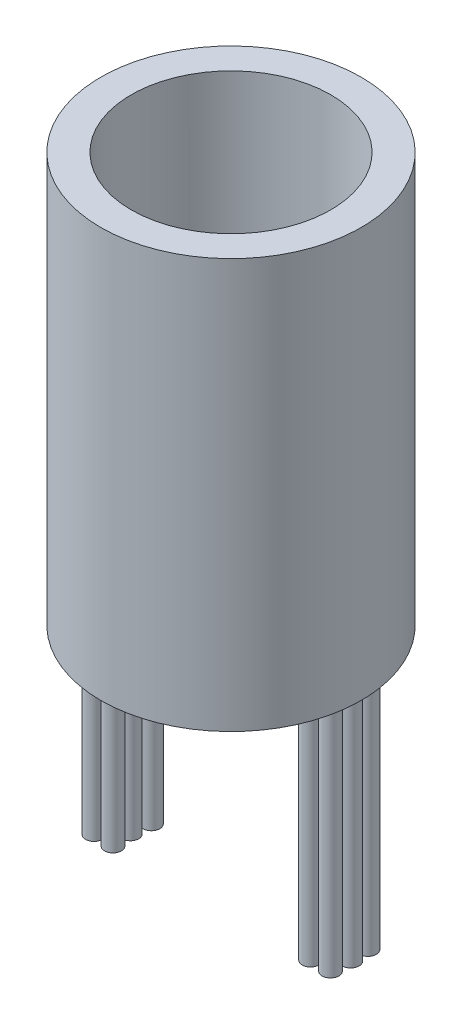
ISO-10303-21;
HEADER;
FILE_DESCRIPTION(('STEP AP214'),'2;1');
FILE_NAME('part.step','',(''),(''),'','','');
FILE_SCHEMA(('AUTOMOTIVE_DESIGN { 1 0 10303 214 1 1 1 1 }'));
ENDSEC;
DATA;
#1=APPLICATION_CONTEXT('core data for automotive mechanical design processes');
#2=APPLICATION_PROTOCOL_DEFINITION('international standard','automotive_design',2000,#1);
#3=PRODUCT_CONTEXT('',#1,'mechanical');
#4=PRODUCT('Part','Part','',(#3));
#5=PRODUCT_RELATED_PRODUCT_CATEGORY('part','',(#4));
#6=PRODUCT_DEFINITION_FORMATION('','',#4);
#7=PRODUCT_DEFINITION_CONTEXT('part definition',#1,'design');
#8=PRODUCT_DEFINITION('design','',#6,#7);
#9=PRODUCT_DEFINITION_SHAPE('','',#8);
#10=(LENGTH_UNIT() NAMED_UNIT(*) SI_UNIT(.MILLI.,.METRE.));
#11=(NAMED_UNIT(*) PLANE_ANGLE_UNIT() SI_UNIT($,.RADIAN.));
#12=(NAMED_UNIT(*) SI_UNIT($,.STERADIAN.) SOLID_ANGLE_UNIT());
#13=UNCERTAINTY_MEASURE_WITH_UNIT(LENGTH_MEASURE(1.E-05),#10,'distance_accuracy_value','');
#14=(GEOMETRIC_REPRESENTATION_CONTEXT(3) GLOBAL_UNCERTAINTY_ASSIGNED_CONTEXT((#13)) GLOBAL_UNIT_ASSIGNED_CONTEXT((#10,
#11,#12)) REPRESENTATION_CONTEXT('',''));
#15=CARTESIAN_POINT('',(0.,0.,0.));
#16=DIRECTION('',(0.,0.,1.));
#17=DIRECTION('',(1.,0.,0.));
#18=AXIS2_PLACEMENT_3D('',#15,#16,#17);
#19=CARTESIAN_POINT('',(0.,19.3,0.));
#20=DIRECTION('',(0.,1.,0.));
#21=DIRECTION('',(0.,0.,1.));
#22=AXIS2_PLACEMENT_3D('',#19,#20,#21);
#23=CYLINDRICAL_SURFACE('',#22,4.75);
#24=CARTESIAN_POINT('',(0.,19.5,0.));
#25=DIRECTION('',(0.,1.,0.));
#26=DIRECTION('',(0.,0.,1.));
#27=AXIS2_PLACEMENT_3D('',#24,#25,#26);
#28=CIRCLE('',#27,4.75);
#29=CARTESIAN_POINT('',(0.,19.5,4.75));
#30=VERTEX_POINT('',#29);
#31=EDGE_CURVE('E313',#30,#30,#28,.T.);
#32=ORIENTED_EDGE('',*,*,#31,.T.);
#33=EDGE_LOOP('',(#32));
#34=FACE_BOUND('',#33,.T.);
#35=CARTESIAN_POINT('',(0.,0.,0.));
#36=DIRECTION('',(0.,1.,0.));
#37=DIRECTION('',(0.,0.,1.));
#38=AXIS2_PLACEMENT_3D('',#35,#36,#37);
#39=CIRCLE('',#38,4.75);
#40=CARTESIAN_POINT('',(-4.57099580963266,0.,1.29170325861657));
#41=VERTEX_POINT('',#40);
#42=CARTESIAN_POINT('',(-4.72203407139843,0.,0.514678762484313));
#43=VERTEX_POINT('',#42);
#44=EDGE_CURVE('E94',#41,#43,#39,.F.);
#45=ORIENTED_EDGE('',*,*,#44,.T.);
#46=CARTESIAN_POINT('',(-4.73348234326202,0.,0.395783913299547));
#47=VERTEX_POINT('',#46);
#48=EDGE_CURVE('E108',#43,#47,#39,.F.);
#49=ORIENTED_EDGE('',*,*,#48,.T.);
#50=CARTESIAN_POINT('',(-4.73348234326202,0.,-0.395783913299547));
#51=VERTEX_POINT('',#50);
#52=EDGE_CURVE('E338',#47,#51,#39,.F.);
#53=ORIENTED_EDGE('',*,*,#52,.T.);
#54=CARTESIAN_POINT('',(-4.72203407139843,0.,-0.514678762484313));
#55=VERTEX_POINT('',#54);
#56=EDGE_CURVE('E333',#51,#55,#39,.F.);
#57=ORIENTED_EDGE('',*,*,#56,.T.);
#58=CARTESIAN_POINT('',(-4.57099580963266,0.,-1.29170325861657));
#59=VERTEX_POINT('',#58);
#60=EDGE_CURVE('E339',#55,#59,#39,.F.);
#61=ORIENTED_EDGE('',*,*,#60,.T.);
#62=CARTESIAN_POINT('',(4.57099580963266,0.,-1.29170325861657));
#63=VERTEX_POINT('',#62);
#64=EDGE_CURVE('E340',#59,#63,#39,.F.);
#65=ORIENTED_EDGE('',*,*,#64,.T.);
#66=CARTESIAN_POINT('',(4.72203407139843,0.,-0.514678762484311));
#67=VERTEX_POINT('',#66);
#68=EDGE_CURVE('E342',#63,#67,#39,.F.);
#69=ORIENTED_EDGE('',*,*,#68,.T.);
#70=CARTESIAN_POINT('',(4.73348234326202,0.,-0.395783913299544));
#71=VERTEX_POINT('',#70);
#72=EDGE_CURVE('E52',#67,#71,#39,.F.);
#73=ORIENTED_EDGE('',*,*,#72,.T.);
#74=CARTESIAN_POINT('',(4.73348234326202,0.,0.395783913299548));
#75=VERTEX_POINT('',#74);
#76=EDGE_CURVE('E267',#71,#75,#39,.F.);
#77=ORIENTED_EDGE('',*,*,#76,.T.);
#78=CARTESIAN_POINT('',(4.72203407139843,0.,0.514678762484313));
#79=VERTEX_POINT('',#78);
#80=EDGE_CURVE('E272',#75,#79,#39,.F.);
#81=ORIENTED_EDGE('',*,*,#80,.T.);
#82=CARTESIAN_POINT('',(4.57099580963266,0.,1.29170325861657));
#83=VERTEX_POINT('',#82);
#84=EDGE_CURVE('E97',#79,#83,#39,.F.);
#85=ORIENTED_EDGE('',*,*,#84,.T.);
#86=EDGE_CURVE('E91',#83,#41,#39,.F.);
#87=ORIENTED_EDGE('',*,*,#86,.T.);
#88=EDGE_LOOP('',(#45,#49,#53,#57,#61,#65,#69,#73,#77,#81,#85,#87));
#89=FACE_BOUND('',#88,.T.);
#90=ADVANCED_FACE('F37',(#34,#89),#23,.F.);
#91=CARTESIAN_POINT('',(0.,0.,0.));
#92=DIRECTION('',(0.,1.,0.));
#93=DIRECTION('',(0.,0.,1.));
#94=AXIS2_PLACEMENT_3D('',#91,#92,#93);
#95=PLANE('',#94);
#96=CARTESIAN_POINT('',(5.70012035558298,0.,0.));
#97=DIRECTION('',(0.,1.,0.));
#98=DIRECTION('',(0.,0.,1.));
#99=AXIS2_PLACEMENT_3D('',#96,#97,#98);
#100=CIRCLE('',#99,0.4);
#101=CARTESIAN_POINT('',(5.70012035558298,0.,0.400000000000001));
#102=VERTEX_POINT('',#101);
#103=EDGE_CURVE('E11',#102,#102,#100,.F.);
#104=ORIENTED_EDGE('',*,*,#103,.F.);
#105=EDGE_LOOP('',(#104));
#106=FACE_BOUND('',#105,.T.);
#107=CARTESIAN_POINT('',(5.62994241519832,0.,0.891695278490557));
#108=DIRECTION('',(0.,1.,0.));
#109=DIRECTION('',(0.,0.,1.));
#110=AXIS2_PLACEMENT_3D('',#107,#108,#109);
#111=CIRCLE('',#110,0.4);
#112=CARTESIAN_POINT('',(5.62994241519832,0.,1.29169527849056));
#113=VERTEX_POINT('',#112);
#114=EDGE_CURVE('E45',#113,#113,#111,.F.);
#115=ORIENTED_EDGE('',*,*,#114,.F.);
#116=EDGE_LOOP('',(#115));
#117=FACE_BOUND('',#116,.T.);
#118=CARTESIAN_POINT('',(4.70337390170855,0.,0.914243273004388));
#119=DIRECTION('',(0.,1.,0.));
#120=DIRECTION('',(0.,0.,1.));
#121=AXIS2_PLACEMENT_3D('',#118,#119,#120);
#122=CIRCLE('',#121,0.4);
#123=EDGE_CURVE('E133',#79,#83,#122,.F.);
#124=ORIENTED_EDGE('',*,*,#123,.F.);
#125=ORIENTED_EDGE('',*,*,#80,.F.);
#126=CARTESIAN_POINT('',(4.79140551628715,0.,0.));
#127=DIRECTION('',(0.,1.,0.));
#128=DIRECTION('',(0.,0.,1.));
#129=AXIS2_PLACEMENT_3D('',#126,#127,#128);
#130=CIRCLE('',#129,0.4);
#131=EDGE_CURVE('E135',#71,#75,#130,.F.);
#132=ORIENTED_EDGE('',*,*,#131,.F.);
#133=ORIENTED_EDGE('',*,*,#72,.F.);
#134=CARTESIAN_POINT('',(4.70337390170855,0.,-0.914243273004386));
#135=DIRECTION('',(0.,1.,0.));
#136=DIRECTION('',(0.,0.,1.));
#137=AXIS2_PLACEMENT_3D('',#134,#135,#136);
#138=CIRCLE('',#137,0.4);
#139=EDGE_CURVE('E130',#63,#67,#138,.F.);
#140=ORIENTED_EDGE('',*,*,#139,.F.);
#141=ORIENTED_EDGE('',*,*,#64,.F.);
#142=CARTESIAN_POINT('',(-4.70337390170855,0.,-0.914243273004387));
#143=DIRECTION('',(0.,1.,0.));
#144=DIRECTION('',(0.,0.,1.));
#145=AXIS2_PLACEMENT_3D('',#142,#143,#144);
#146=CIRCLE('',#145,0.4);
#147=EDGE_CURVE('E118',#55,#59,#146,.F.);
#148=ORIENTED_EDGE('',*,*,#147,.F.);
#149=ORIENTED_EDGE('',*,*,#56,.F.);
#150=CARTESIAN_POINT('',(-4.79140551628715,0.,0.));
#151=DIRECTION('',(0.,1.,0.));
#152=DIRECTION('',(0.,0.,1.));
#153=AXIS2_PLACEMENT_3D('',#150,#151,#152);
#154=CIRCLE('',#153,0.4);
#155=EDGE_CURVE('E324',#47,#51,#154,.F.);
#156=ORIENTED_EDGE('',*,*,#155,.F.);
#157=ORIENTED_EDGE('',*,*,#48,.F.);
#158=CARTESIAN_POINT('',(-4.70337390170855,0.,0.914243273004387));
#159=DIRECTION('',(0.,1.,0.));
#160=DIRECTION('',(0.,0.,1.));
#161=AXIS2_PLACEMENT_3D('',#158,#159,#160);
#162=CIRCLE('',#161,0.4);
#163=EDGE_CURVE('E110',#41,#43,#162,.F.);
#164=ORIENTED_EDGE('',*,*,#163,.F.);
#165=ORIENTED_EDGE('',*,*,#86,.F.);
#166=EDGE_LOOP('',(#124,#125,#132,#133,#140,#141,#148,#149,#156,#157,#164,#165));
#167=FACE_BOUND('',#166,.T.);
#168=CARTESIAN_POINT('',(5.62994241519832,0.,-0.891695278490555));
#169=DIRECTION('',(0.,1.,0.));
#170=DIRECTION('',(0.,0.,1.));
#171=AXIS2_PLACEMENT_3D('',#168,#169,#170);
#172=CIRCLE('',#171,0.4);
#173=CARTESIAN_POINT('',(5.62994241519832,0.,-0.491695278490555));
#174=VERTEX_POINT('',#173);
#175=EDGE_CURVE('E127',#174,#174,#172,.F.);
#176=ORIENTED_EDGE('',*,*,#175,.F.);
#177=EDGE_LOOP('',(#176));
#178=FACE_BOUND('',#177,.T.);
#179=CARTESIAN_POINT('',(-5.62994241519832,0.,-0.891695278490557));
#180=DIRECTION('',(0.,1.,0.));
#181=DIRECTION('',(0.,0.,1.));
#182=AXIS2_PLACEMENT_3D('',#179,#180,#181);
#183=CIRCLE('',#182,0.4);
#184=CARTESIAN_POINT('',(-5.62994241519832,0.,-0.491695278490557));
#185=VERTEX_POINT('',#184);
#186=EDGE_CURVE('E120',#185,#185,#183,.F.);
#187=ORIENTED_EDGE('',*,*,#186,.F.);
#188=EDGE_LOOP('',(#187));
#189=FACE_BOUND('',#188,.T.);
#190=CARTESIAN_POINT('',(-5.62994241519832,0.,0.891695278490557));
#191=DIRECTION('',(0.,1.,0.));
#192=DIRECTION('',(0.,0.,1.));
#193=AXIS2_PLACEMENT_3D('',#190,#191,#192);
#194=CIRCLE('',#193,0.4);
#195=CARTESIAN_POINT('',(-5.62994241519832,0.,1.29169527849056));
#196=VERTEX_POINT('',#195);
#197=EDGE_CURVE('E115',#196,#196,#194,.F.);
#198=ORIENTED_EDGE('',*,*,#197,.F.);
#199=EDGE_LOOP('',(#198));
#200=FACE_BOUND('',#199,.T.);
#201=CARTESIAN_POINT('',(-5.70012035558298,0.,0.));
#202=DIRECTION('',(0.,1.,0.));
#203=DIRECTION('',(0.,0.,1.));
#204=AXIS2_PLACEMENT_3D('',#201,#202,#203);
#205=CIRCLE('',#204,0.4);
#206=CARTESIAN_POINT('',(-5.70012035558298,0.,0.4));
#207=VERTEX_POINT('',#206);
#208=EDGE_CURVE('E320',#207,#207,#205,.F.);
#209=ORIENTED_EDGE('',*,*,#208,.F.);
#210=EDGE_LOOP('',(#209));
#211=FACE_BOUND('',#210,.T.);
#212=CARTESIAN_POINT('',(0.,0.,0.));
#213=DIRECTION('',(0.,1.,0.));
#214=DIRECTION('',(0.,0.,1.));
#215=AXIS2_PLACEMENT_3D('',#212,#213,#214);
#216=CIRCLE('',#215,6.2);
#217=CARTESIAN_POINT('',(0.,0.,6.2));
#218=VERTEX_POINT('',#217);
#219=EDGE_CURVE('E316',#218,#218,#216,.T.);
#220=ORIENTED_EDGE('',*,*,#219,.F.);
#221=EDGE_LOOP('',(#220));
#222=FACE_BOUND('',#221,.T.);
#223=ADVANCED_FACE('F111',(#106,#117,#167,#178,#189,#200,#211,#222),#95,.F.);
#224=CARTESIAN_POINT('',(0.,19.5,0.));
#225=DIRECTION('',(0.,-1.,0.));
#226=DIRECTION('',(0.,0.,-1.));
#227=AXIS2_PLACEMENT_3D('',#224,#225,#226);
#228=CYLINDRICAL_SURFACE('',#227,6.2);
#229=CARTESIAN_POINT('',(0.,19.5,0.));
#230=DIRECTION('',(0.,1.,0.));
#231=DIRECTION('',(0.,0.,1.));
#232=AXIS2_PLACEMENT_3D('',#229,#230,#231);
#233=CIRCLE('',#232,6.2);
#234=CARTESIAN_POINT('',(0.,19.5,6.2));
#235=VERTEX_POINT('',#234);
#236=EDGE_CURVE('E317',#235,#235,#233,.T.);
#237=ORIENTED_EDGE('',*,*,#236,.F.);
#238=EDGE_LOOP('',(#237));
#239=FACE_BOUND('',#238,.T.);
#240=ORIENTED_EDGE('',*,*,#219,.T.);
#241=EDGE_LOOP('',(#240));
#242=FACE_BOUND('',#241,.T.);
#243=ADVANCED_FACE('F39',(#239,#242),#228,.T.);
#244=CARTESIAN_POINT('',(0.,19.5,0.));
#245=DIRECTION('',(0.,1.,0.));
#246=DIRECTION('',(0.,0.,1.));
#247=AXIS2_PLACEMENT_3D('',#244,#245,#246);
#248=PLANE('',#247);
#249=ORIENTED_EDGE('',*,*,#31,.F.);
#250=EDGE_LOOP('',(#249));
#251=FACE_BOUND('',#250,.T.);
#252=ORIENTED_EDGE('',*,*,#236,.T.);
#253=EDGE_LOOP('',(#252));
#254=FACE_BOUND('',#253,.T.);
#255=ADVANCED_FACE('F149',(#251,#254),#248,.T.);
#256=CARTESIAN_POINT('',(-5.70012035558298,-11.,0.));
#257=DIRECTION('',(0.,1.,0.));
#258=DIRECTION('',(0.,0.,1.));
#259=AXIS2_PLACEMENT_3D('',#256,#257,#258);
#260=CYLINDRICAL_SURFACE('',#259,0.4);
#261=CARTESIAN_POINT('',(-5.70012035558298,-11.,0.));
#262=DIRECTION('',(0.,-1.,0.));
#263=DIRECTION('',(0.,0.,-1.));
#264=AXIS2_PLACEMENT_3D('',#261,#262,#263);
#265=CIRCLE('',#264,0.4);
#266=CARTESIAN_POINT('',(-5.70012035558298,-11.,-0.4));
#267=VERTEX_POINT('',#266);
#268=EDGE_CURVE('E310',#267,#267,#265,.T.);
#269=ORIENTED_EDGE('',*,*,#268,.F.);
#270=EDGE_LOOP('',(#269));
#271=FACE_BOUND('',#270,.T.);
#272=ORIENTED_EDGE('',*,*,#208,.T.);
#273=EDGE_LOOP('',(#272));
#274=FACE_BOUND('',#273,.T.);
#275=ADVANCED_FACE('F156',(#271,#274),#260,.T.);
#276=CARTESIAN_POINT('',(-5.70012035558298,-11.,0.));
#277=DIRECTION('',(0.,-1.,0.));
#278=DIRECTION('',(0.,0.,-1.));
#279=AXIS2_PLACEMENT_3D('',#276,#277,#278);
#280=PLANE('',#279);
#281=ORIENTED_EDGE('',*,*,#268,.T.);
#282=EDGE_LOOP('',(#281));
#283=FACE_BOUND('',#282,.T.);
#284=ADVANCED_FACE('F161',(#283),#280,.T.);
#285=CARTESIAN_POINT('',(-4.79140551628715,-11.,0.));
#286=DIRECTION('',(0.,1.,0.));
#287=DIRECTION('',(0.,0.,1.));
#288=AXIS2_PLACEMENT_3D('',#285,#286,#287);
#289=CYLINDRICAL_SURFACE('',#288,0.4);
#290=CARTESIAN_POINT('',(-4.79140551628715,-11.,0.));
#291=DIRECTION('',(0.,-1.,0.));
#292=DIRECTION('',(0.,0.,-1.));
#293=AXIS2_PLACEMENT_3D('',#290,#291,#292);
#294=CIRCLE('',#293,0.4);
#295=CARTESIAN_POINT('',(-4.79140551628715,-11.,-0.4));
#296=VERTEX_POINT('',#295);
#297=EDGE_CURVE('E307',#296,#296,#294,.T.);
#298=ORIENTED_EDGE('',*,*,#297,.F.);
#299=EDGE_LOOP('',(#298));
#300=FACE_BOUND('',#299,.T.);
#301=EDGE_CURVE('E325',#51,#47,#154,.F.);
#302=ORIENTED_EDGE('',*,*,#301,.T.);
#303=ORIENTED_EDGE('',*,*,#155,.T.);
#304=EDGE_LOOP('',(#302,#303));
#305=FACE_BOUND('',#304,.T.);
#306=ADVANCED_FACE('F165',(#300,#305),#289,.T.);
#307=CARTESIAN_POINT('',(-4.79140551628715,-11.,0.));
#308=DIRECTION('',(0.,-1.,0.));
#309=DIRECTION('',(0.,0.,-1.));
#310=AXIS2_PLACEMENT_3D('',#307,#308,#309);
#311=PLANE('',#310);
#312=ORIENTED_EDGE('',*,*,#297,.T.);
#313=EDGE_LOOP('',(#312));
#314=FACE_BOUND('',#313,.T.);
#315=ADVANCED_FACE('F169',(#314),#311,.T.);
#316=CARTESIAN_POINT('',(-5.62994241519832,-11.,0.891695278490557));
#317=DIRECTION('',(0.,1.,0.));
#318=DIRECTION('',(0.,0.,1.));
#319=AXIS2_PLACEMENT_3D('',#316,#317,#318);
#320=CYLINDRICAL_SURFACE('',#319,0.4);
#321=CARTESIAN_POINT('',(-5.62994241519832,-11.,0.891695278490557));
#322=DIRECTION('',(0.,-1.,0.));
#323=DIRECTION('',(0.,0.,-1.));
#324=AXIS2_PLACEMENT_3D('',#321,#322,#323);
#325=CIRCLE('',#324,0.4);
#326=CARTESIAN_POINT('',(-5.62994241519832,-11.,0.491695278490557));
#327=VERTEX_POINT('',#326);
#328=EDGE_CURVE('E304',#327,#327,#325,.T.);
#329=ORIENTED_EDGE('',*,*,#328,.F.);
#330=EDGE_LOOP('',(#329));
#331=FACE_BOUND('',#330,.T.);
#332=ORIENTED_EDGE('',*,*,#197,.T.);
#333=EDGE_LOOP('',(#332));
#334=FACE_BOUND('',#333,.T.);
#335=ADVANCED_FACE('F173',(#331,#334),#320,.T.);
#336=CARTESIAN_POINT('',(-5.62994241519832,-11.,0.891695278490557));
#337=DIRECTION('',(0.,-1.,0.));
#338=DIRECTION('',(0.,0.,-1.));
#339=AXIS2_PLACEMENT_3D('',#336,#337,#338);
#340=PLANE('',#339);
#341=ORIENTED_EDGE('',*,*,#328,.T.);
#342=EDGE_LOOP('',(#341));
#343=FACE_BOUND('',#342,.T.);
#344=ADVANCED_FACE('F177',(#343),#340,.T.);
#345=CARTESIAN_POINT('',(-4.70337390170855,-11.,0.914243273004387));
#346=DIRECTION('',(0.,1.,0.));
#347=DIRECTION('',(0.,0.,1.));
#348=AXIS2_PLACEMENT_3D('',#345,#346,#347);
#349=CYLINDRICAL_SURFACE('',#348,0.4);
#350=CARTESIAN_POINT('',(-4.70337390170855,-11.,0.914243273004387));
#351=DIRECTION('',(0.,-1.,0.));
#352=DIRECTION('',(0.,0.,-1.));
#353=AXIS2_PLACEMENT_3D('',#350,#351,#352);
#354=CIRCLE('',#353,0.4);
#355=CARTESIAN_POINT('',(-4.70337390170855,-11.,0.514243273004388));
#356=VERTEX_POINT('',#355);
#357=EDGE_CURVE('E301',#356,#356,#354,.T.);
#358=ORIENTED_EDGE('',*,*,#357,.F.);
#359=EDGE_LOOP('',(#358));
#360=FACE_BOUND('',#359,.T.);
#361=EDGE_CURVE('E106',#43,#41,#162,.F.);
#362=ORIENTED_EDGE('',*,*,#361,.T.);
#363=ORIENTED_EDGE('',*,*,#163,.T.);
#364=EDGE_LOOP('',(#362,#363));
#365=FACE_BOUND('',#364,.T.);
#366=ADVANCED_FACE('F117',(#360,#365),#349,.T.);
#367=CARTESIAN_POINT('',(-4.70337390170855,-11.,0.914243273004387));
#368=DIRECTION('',(0.,-1.,0.));
#369=DIRECTION('',(0.,0.,-1.));
#370=AXIS2_PLACEMENT_3D('',#367,#368,#369);
#371=PLANE('',#370);
#372=ORIENTED_EDGE('',*,*,#357,.T.);
#373=EDGE_LOOP('',(#372));
#374=FACE_BOUND('',#373,.T.);
#375=ADVANCED_FACE('F184',(#374),#371,.T.);
#376=CARTESIAN_POINT('',(-4.70337390170855,-11.,-0.914243273004387));
#377=DIRECTION('',(0.,1.,0.));
#378=DIRECTION('',(0.,0.,1.));
#379=AXIS2_PLACEMENT_3D('',#376,#377,#378);
#380=CYLINDRICAL_SURFACE('',#379,0.4);
#381=CARTESIAN_POINT('',(-4.70337390170855,-11.,-0.914243273004387));
#382=DIRECTION('',(0.,-1.,0.));
#383=DIRECTION('',(0.,0.,1.));
#384=AXIS2_PLACEMENT_3D('',#381,#382,#383);
#385=CIRCLE('',#384,0.4);
#386=CARTESIAN_POINT('',(-4.70337390170855,-11.,-0.514243273004388));
#387=VERTEX_POINT('',#386);
#388=EDGE_CURVE('E298',#387,#387,#385,.T.);
#389=ORIENTED_EDGE('',*,*,#388,.F.);
#390=EDGE_LOOP('',(#389));
#391=FACE_BOUND('',#390,.T.);
#392=ORIENTED_EDGE('',*,*,#147,.T.);
#393=CARTESIAN_POINT('',(-4.70337390170855,0.,-0.914243273004387));
#394=DIRECTION('',(0.,1.,0.));
#395=DIRECTION('',(0.,0.,1.));
#396=AXIS2_PLACEMENT_3D('',#393,#394,#395);
#397=CIRCLE('',#396,0.4);
#398=EDGE_CURVE('E275',#55,#59,#397,.T.);
#399=ORIENTED_EDGE('',*,*,#398,.F.);
#400=EDGE_LOOP('',(#392,#399));
#401=FACE_BOUND('',#400,.T.);
#402=ADVANCED_FACE('F188',(#391,#401),#380,.T.);
#403=CARTESIAN_POINT('',(-4.70337390170855,-11.,-0.914243273004387));
#404=DIRECTION('',(0.,1.,0.));
#405=DIRECTION('',(0.,0.,1.));
#406=AXIS2_PLACEMENT_3D('',#403,#404,#405);
#407=PLANE('',#406);
#408=ORIENTED_EDGE('',*,*,#388,.T.);
#409=EDGE_LOOP('',(#408));
#410=FACE_BOUND('',#409,.T.);
#411=ADVANCED_FACE('F192',(#410),#407,.F.);
#412=CARTESIAN_POINT('',(-5.62994241519832,-11.,-0.891695278490557));
#413=DIRECTION('',(0.,1.,0.));
#414=DIRECTION('',(0.,0.,1.));
#415=AXIS2_PLACEMENT_3D('',#412,#413,#414);
#416=CYLINDRICAL_SURFACE('',#415,0.4);
#417=CARTESIAN_POINT('',(-5.62994241519832,-11.,-0.891695278490557));
#418=DIRECTION('',(0.,-1.,0.));
#419=DIRECTION('',(0.,0.,1.));
#420=AXIS2_PLACEMENT_3D('',#417,#418,#419);
#421=CIRCLE('',#420,0.4);
#422=CARTESIAN_POINT('',(-5.62994241519832,-11.,-0.491695278490557));
#423=VERTEX_POINT('',#422);
#424=EDGE_CURVE('E295',#423,#423,#421,.T.);
#425=ORIENTED_EDGE('',*,*,#424,.F.);
#426=EDGE_LOOP('',(#425));
#427=FACE_BOUND('',#426,.T.);
#428=ORIENTED_EDGE('',*,*,#186,.T.);
#429=EDGE_LOOP('',(#428));
#430=FACE_BOUND('',#429,.T.);
#431=ADVANCED_FACE('F196',(#427,#430),#416,.T.);
#432=CARTESIAN_POINT('',(-5.62994241519832,-11.,-0.891695278490557));
#433=DIRECTION('',(0.,1.,0.));
#434=DIRECTION('',(0.,0.,1.));
#435=AXIS2_PLACEMENT_3D('',#432,#433,#434);
#436=PLANE('',#435);
#437=ORIENTED_EDGE('',*,*,#424,.T.);
#438=EDGE_LOOP('',(#437));
#439=FACE_BOUND('',#438,.T.);
#440=ADVANCED_FACE('F200',(#439),#436,.F.);
#441=CARTESIAN_POINT('',(5.62994241519832,-11.,-0.891695278490555));
#442=DIRECTION('',(0.,1.,0.));
#443=DIRECTION('',(0.,0.,1.));
#444=AXIS2_PLACEMENT_3D('',#441,#442,#443);
#445=CYLINDRICAL_SURFACE('',#444,0.4);
#446=CARTESIAN_POINT('',(5.62994241519832,-11.,-0.891695278490555));
#447=DIRECTION('',(0.,-1.,0.));
#448=DIRECTION('',(0.,0.,-1.));
#449=AXIS2_PLACEMENT_3D('',#446,#447,#448);
#450=CIRCLE('',#449,0.4);
#451=CARTESIAN_POINT('',(5.62994241519832,-11.,-1.29169527849055));
#452=VERTEX_POINT('',#451);
#453=EDGE_CURVE('E292',#452,#452,#450,.T.);
#454=ORIENTED_EDGE('',*,*,#453,.F.);
#455=EDGE_LOOP('',(#454));
#456=FACE_BOUND('',#455,.T.);
#457=ORIENTED_EDGE('',*,*,#175,.T.);
#458=EDGE_LOOP('',(#457));
#459=FACE_BOUND('',#458,.T.);
#460=ADVANCED_FACE('F204',(#456,#459),#445,.T.);
#461=CARTESIAN_POINT('',(5.62994241519832,-11.,-0.891695278490555));
#462=DIRECTION('',(0.,-1.,0.));
#463=DIRECTION('',(0.,0.,-1.));
#464=AXIS2_PLACEMENT_3D('',#461,#462,#463);
#465=PLANE('',#464);
#466=ORIENTED_EDGE('',*,*,#453,.T.);
#467=EDGE_LOOP('',(#466));
#468=FACE_BOUND('',#467,.T.);
#469=ADVANCED_FACE('F208',(#468),#465,.T.);
#470=CARTESIAN_POINT('',(4.70337390170855,-11.,-0.914243273004386));
#471=DIRECTION('',(0.,1.,0.));
#472=DIRECTION('',(0.,0.,1.));
#473=AXIS2_PLACEMENT_3D('',#470,#471,#472);
#474=CYLINDRICAL_SURFACE('',#473,0.4);
#475=CARTESIAN_POINT('',(4.70337390170855,-11.,-0.914243273004386));
#476=DIRECTION('',(0.,-1.,0.));
#477=DIRECTION('',(0.,0.,-1.));
#478=AXIS2_PLACEMENT_3D('',#475,#476,#477);
#479=CIRCLE('',#478,0.4);
#480=CARTESIAN_POINT('',(4.70337390170855,-11.,-1.31424327300439));
#481=VERTEX_POINT('',#480);
#482=EDGE_CURVE('E289',#481,#481,#479,.T.);
#483=ORIENTED_EDGE('',*,*,#482,.F.);
#484=EDGE_LOOP('',(#483));
#485=FACE_BOUND('',#484,.T.);
#486=ORIENTED_EDGE('',*,*,#139,.T.);
#487=CARTESIAN_POINT('',(4.70337390170855,0.,-0.914243273004386));
#488=DIRECTION('',(0.,1.,0.));
#489=DIRECTION('',(0.,0.,1.));
#490=AXIS2_PLACEMENT_3D('',#487,#488,#489);
#491=CIRCLE('',#490,0.4);
#492=EDGE_CURVE('E107',#63,#67,#491,.T.);
#493=ORIENTED_EDGE('',*,*,#492,.F.);
#494=EDGE_LOOP('',(#486,#493));
#495=FACE_BOUND('',#494,.T.);
#496=ADVANCED_FACE('F212',(#485,#495),#474,.T.);
#497=CARTESIAN_POINT('',(4.70337390170855,-11.,-0.914243273004386));
#498=DIRECTION('',(0.,-1.,0.));
#499=DIRECTION('',(0.,0.,-1.));
#500=AXIS2_PLACEMENT_3D('',#497,#498,#499);
#501=PLANE('',#500);
#502=ORIENTED_EDGE('',*,*,#482,.T.);
#503=EDGE_LOOP('',(#502));
#504=FACE_BOUND('',#503,.T.);
#505=ADVANCED_FACE('F216',(#504),#501,.T.);
#506=CARTESIAN_POINT('',(4.70337390170855,-11.,0.914243273004388));
#507=DIRECTION('',(0.,1.,0.));
#508=DIRECTION('',(0.,0.,1.));
#509=AXIS2_PLACEMENT_3D('',#506,#507,#508);
#510=CYLINDRICAL_SURFACE('',#509,0.4);
#511=CARTESIAN_POINT('',(4.70337390170855,-11.,0.914243273004388));
#512=DIRECTION('',(0.,-1.,0.));
#513=DIRECTION('',(0.,0.,1.));
#514=AXIS2_PLACEMENT_3D('',#511,#512,#513);
#515=CIRCLE('',#514,0.4);
#516=CARTESIAN_POINT('',(4.70337390170855,-11.,1.31424327300439));
#517=VERTEX_POINT('',#516);
#518=EDGE_CURVE('E286',#517,#517,#515,.T.);
#519=ORIENTED_EDGE('',*,*,#518,.F.);
#520=EDGE_LOOP('',(#519));
#521=FACE_BOUND('',#520,.T.);
#522=EDGE_CURVE('E59',#83,#79,#122,.F.);
#523=ORIENTED_EDGE('',*,*,#522,.T.);
#524=ORIENTED_EDGE('',*,*,#123,.T.);
#525=EDGE_LOOP('',(#523,#524));
#526=FACE_BOUND('',#525,.T.);
#527=ADVANCED_FACE('F220',(#521,#526),#510,.T.);
#528=CARTESIAN_POINT('',(4.70337390170855,-11.,0.914243273004388));
#529=DIRECTION('',(0.,1.,0.));
#530=DIRECTION('',(0.,0.,1.));
#531=AXIS2_PLACEMENT_3D('',#528,#529,#530);
#532=PLANE('',#531);
#533=ORIENTED_EDGE('',*,*,#518,.T.);
#534=EDGE_LOOP('',(#533));
#535=FACE_BOUND('',#534,.T.);
#536=ADVANCED_FACE('F224',(#535),#532,.F.);
#537=CARTESIAN_POINT('',(4.79140551628715,-11.,0.));
#538=DIRECTION('',(0.,1.,0.));
#539=DIRECTION('',(0.,0.,1.));
#540=AXIS2_PLACEMENT_3D('',#537,#538,#539);
#541=CYLINDRICAL_SURFACE('',#540,0.4);
#542=CARTESIAN_POINT('',(4.79140551628715,-11.,0.));
#543=DIRECTION('',(0.,-1.,0.));
#544=DIRECTION('',(0.,0.,1.));
#545=AXIS2_PLACEMENT_3D('',#542,#543,#544);
#546=CIRCLE('',#545,0.4);
#547=CARTESIAN_POINT('',(4.79140551628715,-11.,0.400000000000001));
#548=VERTEX_POINT('',#547);
#549=EDGE_CURVE('E283',#548,#548,#546,.T.);
#550=ORIENTED_EDGE('',*,*,#549,.F.);
#551=EDGE_LOOP('',(#550));
#552=FACE_BOUND('',#551,.T.);
#553=EDGE_CURVE('E136',#75,#71,#130,.F.);
#554=ORIENTED_EDGE('',*,*,#553,.T.);
#555=ORIENTED_EDGE('',*,*,#131,.T.);
#556=EDGE_LOOP('',(#554,#555));
#557=FACE_BOUND('',#556,.T.);
#558=ADVANCED_FACE('F228',(#552,#557),#541,.T.);
#559=CARTESIAN_POINT('',(4.79140551628715,-11.,0.));
#560=DIRECTION('',(0.,1.,0.));
#561=DIRECTION('',(0.,0.,1.));
#562=AXIS2_PLACEMENT_3D('',#559,#560,#561);
#563=PLANE('',#562);
#564=ORIENTED_EDGE('',*,*,#549,.T.);
#565=EDGE_LOOP('',(#564));
#566=FACE_BOUND('',#565,.T.);
#567=ADVANCED_FACE('F232',(#566),#563,.F.);
#568=CARTESIAN_POINT('',(5.62994241519832,-11.,0.891695278490557));
#569=DIRECTION('',(0.,1.,0.));
#570=DIRECTION('',(0.,0.,1.));
#571=AXIS2_PLACEMENT_3D('',#568,#569,#570);
#572=CYLINDRICAL_SURFACE('',#571,0.4);
#573=CARTESIAN_POINT('',(5.62994241519832,-11.,0.891695278490557));
#574=DIRECTION('',(0.,-1.,0.));
#575=DIRECTION('',(0.,0.,1.));
#576=AXIS2_PLACEMENT_3D('',#573,#574,#575);
#577=CIRCLE('',#576,0.4);
#578=CARTESIAN_POINT('',(5.62994241519832,-11.,1.29169527849056));
#579=VERTEX_POINT('',#578);
#580=EDGE_CURVE('E280',#579,#579,#577,.T.);
#581=ORIENTED_EDGE('',*,*,#580,.F.);
#582=EDGE_LOOP('',(#581));
#583=FACE_BOUND('',#582,.T.);
#584=ORIENTED_EDGE('',*,*,#114,.T.);
#585=EDGE_LOOP('',(#584));
#586=FACE_BOUND('',#585,.T.);
#587=ADVANCED_FACE('F141',(#583,#586),#572,.T.);
#588=CARTESIAN_POINT('',(5.62994241519832,-11.,0.891695278490557));
#589=DIRECTION('',(0.,1.,0.));
#590=DIRECTION('',(0.,0.,1.));
#591=AXIS2_PLACEMENT_3D('',#588,#589,#590);
#592=PLANE('',#591);
#593=ORIENTED_EDGE('',*,*,#580,.T.);
#594=EDGE_LOOP('',(#593));
#595=FACE_BOUND('',#594,.T.);
#596=ADVANCED_FACE('F239',(#595),#592,.F.);
#597=CARTESIAN_POINT('',(5.70012035558298,-11.,0.));
#598=DIRECTION('',(0.,1.,0.));
#599=DIRECTION('',(0.,0.,1.));
#600=AXIS2_PLACEMENT_3D('',#597,#598,#599);
#601=CYLINDRICAL_SURFACE('',#600,0.4);
#602=CARTESIAN_POINT('',(5.70012035558298,-11.,0.));
#603=DIRECTION('',(0.,-1.,0.));
#604=DIRECTION('',(0.,0.,1.));
#605=AXIS2_PLACEMENT_3D('',#602,#603,#604);
#606=CIRCLE('',#605,0.4);
#607=CARTESIAN_POINT('',(5.70012035558298,-11.,0.400000000000001));
#608=VERTEX_POINT('',#607);
#609=EDGE_CURVE('E277',#608,#608,#606,.T.);
#610=ORIENTED_EDGE('',*,*,#609,.F.);
#611=EDGE_LOOP('',(#610));
#612=FACE_BOUND('',#611,.T.);
#613=ORIENTED_EDGE('',*,*,#103,.T.);
#614=EDGE_LOOP('',(#613));
#615=FACE_BOUND('',#614,.T.);
#616=ADVANCED_FACE('F243',(#612,#615),#601,.T.);
#617=CARTESIAN_POINT('',(5.70012035558298,-11.,0.));
#618=DIRECTION('',(0.,1.,0.));
#619=DIRECTION('',(0.,0.,1.));
#620=AXIS2_PLACEMENT_3D('',#617,#618,#619);
#621=PLANE('',#620);
#622=ORIENTED_EDGE('',*,*,#609,.T.);
#623=EDGE_LOOP('',(#622));
#624=FACE_BOUND('',#623,.T.);
#625=ADVANCED_FACE('F247',(#624),#621,.F.);
#626=CARTESIAN_POINT('',(0.,0.,0.));
#627=DIRECTION('',(0.,1.,0.));
#628=DIRECTION('',(0.,0.,1.));
#629=AXIS2_PLACEMENT_3D('',#626,#627,#628);
#630=PLANE('',#629);
#631=ORIENTED_EDGE('',*,*,#301,.F.);
#632=ORIENTED_EDGE('',*,*,#52,.F.);
#633=EDGE_LOOP('',(#631,#632));
#634=FACE_BOUND('',#633,.T.);
#635=ADVANCED_FACE('F251',(#634),#630,.T.);
#636=ORIENTED_EDGE('',*,*,#361,.F.);
#637=ORIENTED_EDGE('',*,*,#44,.F.);
#638=EDGE_LOOP('',(#636,#637));
#639=FACE_BOUND('',#638,.T.);
#640=ADVANCED_FACE('F104',(#639),#630,.T.);
#641=ORIENTED_EDGE('',*,*,#398,.T.);
#642=ORIENTED_EDGE('',*,*,#60,.F.);
#643=EDGE_LOOP('',(#641,#642));
#644=FACE_BOUND('',#643,.T.);
#645=ADVANCED_FACE('F259',(#644),#630,.T.);
#646=ORIENTED_EDGE('',*,*,#492,.T.);
#647=ORIENTED_EDGE('',*,*,#68,.F.);
#648=EDGE_LOOP('',(#646,#647));
#649=FACE_BOUND('',#648,.T.);
#650=ADVANCED_FACE('F266',(#649),#630,.T.);
#651=ORIENTED_EDGE('',*,*,#522,.F.);
#652=ORIENTED_EDGE('',*,*,#84,.F.);
#653=EDGE_LOOP('',(#651,#652));
#654=FACE_BOUND('',#653,.T.);
#655=ADVANCED_FACE('F261',(#654),#630,.T.);
#656=ORIENTED_EDGE('',*,*,#553,.F.);
#657=ORIENTED_EDGE('',*,*,#76,.F.);
#658=EDGE_LOOP('',(#656,#657));
#659=FACE_BOUND('',#658,.T.);
#660=ADVANCED_FACE('F255',(#659),#630,.T.);
#661=CLOSED_SHELL('',(#90,#223,#243,#255,#275,#284,#306,#315,#335,#344,#366,#375,#402,#411,#431,
#440,#460,#469,#496,#505,#527,#536,#558,#567,#587,#596,#616,#625,#635,#640,#645,#650,#655,#660));
#662=MANIFOLD_SOLID_BREP('B2',#661);
#663=ADVANCED_BREP_SHAPE_REPRESENTATION('',(#18,#662),#14);
#664=SHAPE_DEFINITION_REPRESENTATION(#9,#663);
ENDSEC;
END-ISO-10303-21;
